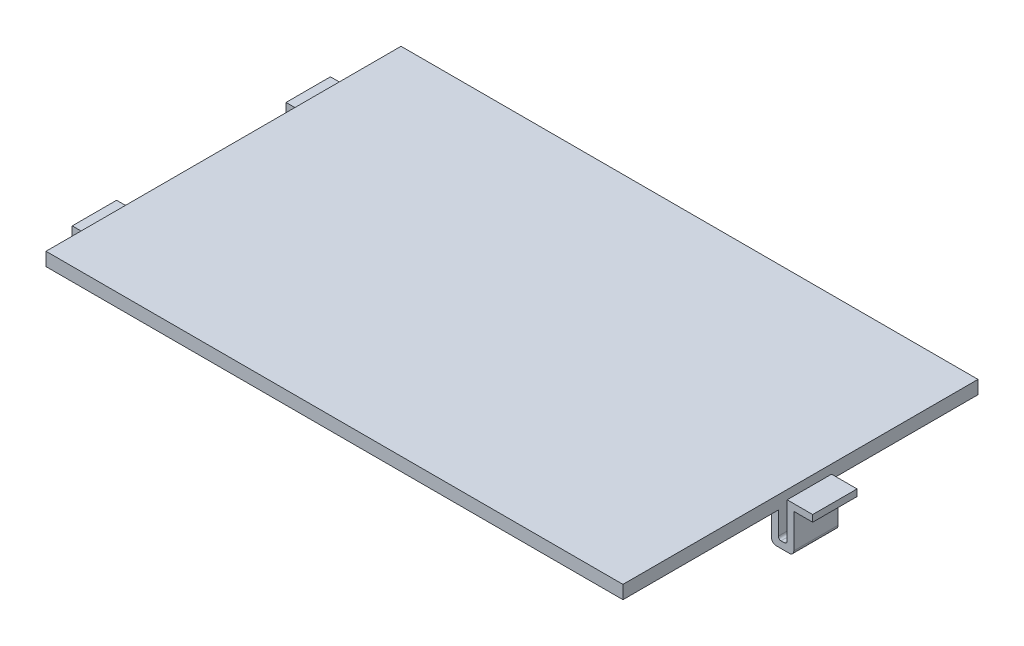
ISO-10303-21;
HEADER;
FILE_DESCRIPTION(('STEP AP214'),'2;1');
FILE_NAME('part.step','',(''),(''),'','','');
FILE_SCHEMA(('AUTOMOTIVE_DESIGN { 1 0 10303 214 1 1 1 1 }'));
ENDSEC;
DATA;
#1=APPLICATION_CONTEXT('core data for automotive mechanical design processes');
#2=APPLICATION_PROTOCOL_DEFINITION('international standard','automotive_design',2000,#1);
#3=PRODUCT_CONTEXT('',#1,'mechanical');
#4=PRODUCT('Part','Part','',(#3));
#5=PRODUCT_RELATED_PRODUCT_CATEGORY('part','',(#4));
#6=PRODUCT_DEFINITION_FORMATION('','',#4);
#7=PRODUCT_DEFINITION_CONTEXT('part definition',#1,'design');
#8=PRODUCT_DEFINITION('design','',#6,#7);
#9=PRODUCT_DEFINITION_SHAPE('','',#8);
#10=(LENGTH_UNIT() NAMED_UNIT(*) SI_UNIT(.MILLI.,.METRE.));
#11=(NAMED_UNIT(*) PLANE_ANGLE_UNIT() SI_UNIT($,.RADIAN.));
#12=(NAMED_UNIT(*) SI_UNIT($,.STERADIAN.) SOLID_ANGLE_UNIT());
#13=UNCERTAINTY_MEASURE_WITH_UNIT(LENGTH_MEASURE(1.E-05),#10,'distance_accuracy_value','');
#14=(GEOMETRIC_REPRESENTATION_CONTEXT(3) GLOBAL_UNCERTAINTY_ASSIGNED_CONTEXT((#13)) GLOBAL_UNIT_ASSIGNED_CONTEXT((#10,
#11,#12)) REPRESENTATION_CONTEXT('',''));
#15=CARTESIAN_POINT('',(0.,0.,0.));
#16=DIRECTION('',(0.,0.,1.));
#17=DIRECTION('',(1.,0.,0.));
#18=AXIS2_PLACEMENT_3D('',#15,#16,#17);
#19=CARTESIAN_POINT('',(-65.,3.,-40.));
#20=DIRECTION('',(1.,0.,0.));
#21=DIRECTION('',(0.,0.,-1.));
#22=AXIS2_PLACEMENT_3D('',#19,#20,#21);
#23=PLANE('',#22);
#24=DIRECTION('',(0.,0.,-1.));
#25=VECTOR('',#24,1.);
#26=CARTESIAN_POINT('',(-65.,0.,19.0899000892805));
#27=LINE('',#26,#25);
#28=CARTESIAN_POINT('',(-65.,0.,29.0899000892805));
#29=VERTEX_POINT('',#28);
#30=CARTESIAN_POINT('',(-65.,0.,19.0899000892805));
#31=VERTEX_POINT('',#30);
#32=EDGE_CURVE('E255',#29,#31,#27,.T.);
#33=ORIENTED_EDGE('',*,*,#32,.F.);
#34=DIRECTION('',(0.,0.,1.));
#35=VECTOR('',#34,1.);
#36=CARTESIAN_POINT('',(-65.,0.,-40.));
#37=LINE('',#36,#35);
#38=CARTESIAN_POINT('',(-65.,0.,40.));
#39=VERTEX_POINT('',#38);
#40=EDGE_CURVE('E498',#29,#39,#37,.T.);
#41=ORIENTED_EDGE('',*,*,#40,.T.);
#42=DIRECTION('',(0.,-1.,0.));
#43=VECTOR('',#42,1.);
#44=CARTESIAN_POINT('',(-65.,3.,40.));
#45=LINE('',#44,#43);
#46=CARTESIAN_POINT('',(-65.,3.,40.));
#47=VERTEX_POINT('',#46);
#48=EDGE_CURVE('E508',#47,#39,#45,.T.);
#49=ORIENTED_EDGE('',*,*,#48,.F.);
#50=DIRECTION('',(0.,0.,1.));
#51=VECTOR('',#50,1.);
#52=CARTESIAN_POINT('',(-65.,3.,-40.));
#53=LINE('',#52,#51);
#54=CARTESIAN_POINT('',(-65.,3.,-40.));
#55=VERTEX_POINT('',#54);
#56=EDGE_CURVE('E484',#55,#47,#53,.T.);
#57=ORIENTED_EDGE('',*,*,#56,.F.);
#58=DIRECTION('',(0.,-1.,0.));
#59=VECTOR('',#58,1.);
#60=CARTESIAN_POINT('',(-65.,3.,-40.));
#61=LINE('',#60,#59);
#62=CARTESIAN_POINT('',(-65.,0.,-40.));
#63=VERTEX_POINT('',#62);
#64=EDGE_CURVE('E512',#55,#63,#61,.T.);
#65=ORIENTED_EDGE('',*,*,#64,.T.);
#66=CARTESIAN_POINT('',(-65.,0.,-29.0899000892805));
#67=VERTEX_POINT('',#66);
#68=EDGE_CURVE('E499',#63,#67,#37,.T.);
#69=ORIENTED_EDGE('',*,*,#68,.T.);
#70=DIRECTION('',(0.,0.,-1.));
#71=VECTOR('',#70,1.);
#72=CARTESIAN_POINT('',(-65.,0.,-29.0899000892805));
#73=LINE('',#72,#71);
#74=CARTESIAN_POINT('',(-65.,0.,-19.0899000892805));
#75=VERTEX_POINT('',#74);
#76=EDGE_CURVE('E55',#75,#67,#73,.T.);
#77=ORIENTED_EDGE('',*,*,#76,.F.);
#78=EDGE_CURVE('E502',#75,#31,#37,.T.);
#79=ORIENTED_EDGE('',*,*,#78,.T.);
#80=EDGE_LOOP('',(#33,#41,#49,#57,#65,#69,#77,#79));
#81=FACE_BOUND('',#80,.T.);
#82=ADVANCED_FACE('F39',(#81),#23,.F.);
#83=CARTESIAN_POINT('',(0.,0.,0.));
#84=DIRECTION('',(0.,1.,0.));
#85=DIRECTION('',(0.,0.,1.));
#86=AXIS2_PLACEMENT_3D('',#83,#84,#85);
#87=PLANE('',#86);
#88=DIRECTION('',(1.,0.,0.));
#89=VECTOR('',#88,1.);
#90=CARTESIAN_POINT('',(-65.,0.,-29.0899000892805));
#91=LINE('',#90,#89);
#92=CARTESIAN_POINT('',(-61.,0.,-29.0899000892805));
#93=VERTEX_POINT('',#92);
#94=EDGE_CURVE('E294',#67,#93,#91,.T.);
#95=ORIENTED_EDGE('',*,*,#94,.F.);
#96=ORIENTED_EDGE('',*,*,#68,.F.);
#97=DIRECTION('',(-1.,0.,0.));
#98=VECTOR('',#97,1.);
#99=CARTESIAN_POINT('',(-65.,0.,-40.));
#100=LINE('',#99,#98);
#101=CARTESIAN_POINT('',(65.,0.,-40.));
#102=VERTEX_POINT('',#101);
#103=EDGE_CURVE('E495',#102,#63,#100,.T.);
#104=ORIENTED_EDGE('',*,*,#103,.F.);
#105=DIRECTION('',(0.,0.,-1.));
#106=VECTOR('',#105,1.);
#107=CARTESIAN_POINT('',(65.,0.,-40.));
#108=LINE('',#107,#106);
#109=CARTESIAN_POINT('',(65.,0.,-5.));
#110=VERTEX_POINT('',#109);
#111=EDGE_CURVE('E442',#110,#102,#108,.T.);
#112=ORIENTED_EDGE('',*,*,#111,.F.);
#113=DIRECTION('',(1.,0.,0.));
#114=VECTOR('',#113,1.);
#115=CARTESIAN_POINT('',(0.,0.,-5.));
#116=LINE('',#115,#114);
#117=CARTESIAN_POINT('',(63.5,0.,-5.));
#118=VERTEX_POINT('',#117);
#119=EDGE_CURVE('E11',#118,#110,#116,.T.);
#120=ORIENTED_EDGE('',*,*,#119,.F.);
#121=DIRECTION('',(0.,0.,1.));
#122=VECTOR('',#121,1.);
#123=CARTESIAN_POINT('',(63.5,0.,0.));
#124=LINE('',#123,#122);
#125=CARTESIAN_POINT('',(63.5,0.,5.));
#126=VERTEX_POINT('',#125);
#127=EDGE_CURVE('E48',#118,#126,#124,.T.);
#128=ORIENTED_EDGE('',*,*,#127,.T.);
#129=DIRECTION('',(1.,0.,0.));
#130=VECTOR('',#129,1.);
#131=CARTESIAN_POINT('',(0.,0.,5.));
#132=LINE('',#131,#130);
#133=CARTESIAN_POINT('',(65.,0.,5.));
#134=VERTEX_POINT('',#133);
#135=EDGE_CURVE('E520',#126,#134,#132,.T.);
#136=ORIENTED_EDGE('',*,*,#135,.T.);
#137=CARTESIAN_POINT('',(65.,0.,40.));
#138=VERTEX_POINT('',#137);
#139=EDGE_CURVE('E491',#138,#134,#108,.T.);
#140=ORIENTED_EDGE('',*,*,#139,.F.);
#141=DIRECTION('',(1.,0.,0.));
#142=VECTOR('',#141,1.);
#143=CARTESIAN_POINT('',(-65.,0.,40.));
#144=LINE('',#143,#142);
#145=EDGE_CURVE('E481',#39,#138,#144,.T.);
#146=ORIENTED_EDGE('',*,*,#145,.F.);
#147=ORIENTED_EDGE('',*,*,#40,.F.);
#148=DIRECTION('',(-1.,0.,0.));
#149=VECTOR('',#148,1.);
#150=CARTESIAN_POINT('',(-65.,0.,29.0899000892805));
#151=LINE('',#150,#149);
#152=CARTESIAN_POINT('',(-61.,0.,29.0899000892805));
#153=VERTEX_POINT('',#152);
#154=EDGE_CURVE('E238',#153,#29,#151,.T.);
#155=ORIENTED_EDGE('',*,*,#154,.F.);
#156=DIRECTION('',(0.,0.,1.));
#157=VECTOR('',#156,1.);
#158=CARTESIAN_POINT('',(-61.,0.,29.0899000892805));
#159=LINE('',#158,#157);
#160=CARTESIAN_POINT('',(-61.,0.,19.0899000892805));
#161=VERTEX_POINT('',#160);
#162=EDGE_CURVE('E328',#161,#153,#159,.T.);
#163=ORIENTED_EDGE('',*,*,#162,.F.);
#164=DIRECTION('',(1.,0.,0.));
#165=VECTOR('',#164,1.);
#166=CARTESIAN_POINT('',(-65.,0.,19.0899000892805));
#167=LINE('',#166,#165);
#168=EDGE_CURVE('E319',#31,#161,#167,.T.);
#169=ORIENTED_EDGE('',*,*,#168,.F.);
#170=ORIENTED_EDGE('',*,*,#78,.F.);
#171=DIRECTION('',(-1.,0.,0.));
#172=VECTOR('',#171,1.);
#173=CARTESIAN_POINT('',(-65.,0.,-19.0899000892805));
#174=LINE('',#173,#172);
#175=CARTESIAN_POINT('',(-61.,0.,-19.0899000892805));
#176=VERTEX_POINT('',#175);
#177=EDGE_CURVE('E299',#176,#75,#174,.T.);
#178=ORIENTED_EDGE('',*,*,#177,.F.);
#179=DIRECTION('',(0.,0.,1.));
#180=VECTOR('',#179,1.);
#181=CARTESIAN_POINT('',(-61.,0.,-29.0899000892805));
#182=LINE('',#181,#180);
#183=EDGE_CURVE('E308',#93,#176,#182,.T.);
#184=ORIENTED_EDGE('',*,*,#183,.F.);
#185=EDGE_LOOP('',(#95,#96,#104,#112,#120,#128,#136,#140,#146,#147,#155,#163,#169,#170,#178,#184));
#186=FACE_BOUND('',#185,.T.);
#187=ADVANCED_FACE('F527',(#186),#87,.F.);
#188=CARTESIAN_POINT('',(65.,3.,-40.));
#189=DIRECTION('',(-1.,0.,0.));
#190=DIRECTION('',(0.,0.,1.));
#191=AXIS2_PLACEMENT_3D('',#188,#189,#190);
#192=PLANE('',#191);
#193=DIRECTION('',(0.,1.,0.));
#194=VECTOR('',#193,1.);
#195=CARTESIAN_POINT('',(65.,-5.10545533298224,-5.));
#196=LINE('',#195,#194);
#197=CARTESIAN_POINT('',(65.,-5.10545533298225,-5.));
#198=VERTEX_POINT('',#197);
#199=EDGE_CURVE('E434',#198,#110,#196,.T.);
#200=ORIENTED_EDGE('',*,*,#199,.T.);
#201=ORIENTED_EDGE('',*,*,#111,.T.);
#202=DIRECTION('',(0.,-1.,0.));
#203=VECTOR('',#202,1.);
#204=CARTESIAN_POINT('',(65.,3.,-40.));
#205=LINE('',#204,#203);
#206=CARTESIAN_POINT('',(65.,3.,-40.));
#207=VERTEX_POINT('',#206);
#208=EDGE_CURVE('E516',#207,#102,#205,.T.);
#209=ORIENTED_EDGE('',*,*,#208,.F.);
#210=DIRECTION('',(0.,0.,-1.));
#211=VECTOR('',#210,1.);
#212=CARTESIAN_POINT('',(65.,3.,-40.));
#213=LINE('',#212,#211);
#214=CARTESIAN_POINT('',(65.,3.,40.));
#215=VERTEX_POINT('',#214);
#216=EDGE_CURVE('E476',#215,#207,#213,.T.);
#217=ORIENTED_EDGE('',*,*,#216,.F.);
#218=DIRECTION('',(0.,-1.,0.));
#219=VECTOR('',#218,1.);
#220=CARTESIAN_POINT('',(65.,3.,40.));
#221=LINE('',#220,#219);
#222=EDGE_CURVE('E490',#215,#138,#221,.T.);
#223=ORIENTED_EDGE('',*,*,#222,.T.);
#224=ORIENTED_EDGE('',*,*,#139,.T.);
#225=DIRECTION('',(0.,1.,0.));
#226=VECTOR('',#225,1.);
#227=CARTESIAN_POINT('',(65.,-5.10545533298224,5.));
#228=LINE('',#227,#226);
#229=CARTESIAN_POINT('',(65.,-5.10545533298225,5.));
#230=VERTEX_POINT('',#229);
#231=EDGE_CURVE('E63',#230,#134,#228,.T.);
#232=ORIENTED_EDGE('',*,*,#231,.F.);
#233=DIRECTION('',(0.,0.,1.));
#234=VECTOR('',#233,1.);
#235=CARTESIAN_POINT('',(65.,-5.10545533298225,-5.));
#236=LINE('',#235,#234);
#237=EDGE_CURVE('E439',#198,#230,#236,.T.);
#238=ORIENTED_EDGE('',*,*,#237,.F.);
#239=EDGE_LOOP('',(#200,#201,#209,#217,#223,#224,#232,#238));
#240=FACE_BOUND('',#239,.T.);
#241=ADVANCED_FACE('F41',(#240),#192,.F.);
#242=CARTESIAN_POINT('',(-65.,3.,-40.));
#243=DIRECTION('',(0.,0.,1.));
#244=DIRECTION('',(1.,0.,0.));
#245=AXIS2_PLACEMENT_3D('',#242,#243,#244);
#246=PLANE('',#245);
#247=ORIENTED_EDGE('',*,*,#103,.T.);
#248=ORIENTED_EDGE('',*,*,#64,.F.);
#249=DIRECTION('',(-1.,0.,0.));
#250=VECTOR('',#249,1.);
#251=CARTESIAN_POINT('',(-65.,3.,-40.));
#252=LINE('',#251,#250);
#253=EDGE_CURVE('E480',#207,#55,#252,.T.);
#254=ORIENTED_EDGE('',*,*,#253,.F.);
#255=ORIENTED_EDGE('',*,*,#208,.T.);
#256=EDGE_LOOP('',(#247,#248,#254,#255));
#257=FACE_BOUND('',#256,.T.);
#258=ADVANCED_FACE('F629',(#257),#246,.F.);
#259=CARTESIAN_POINT('',(-65.,3.,40.));
#260=DIRECTION('',(0.,0.,-1.));
#261=DIRECTION('',(-1.,0.,0.));
#262=AXIS2_PLACEMENT_3D('',#259,#260,#261);
#263=PLANE('',#262);
#264=ORIENTED_EDGE('',*,*,#145,.T.);
#265=ORIENTED_EDGE('',*,*,#222,.F.);
#266=DIRECTION('',(1.,0.,0.));
#267=VECTOR('',#266,1.);
#268=CARTESIAN_POINT('',(-65.,3.,40.));
#269=LINE('',#268,#267);
#270=EDGE_CURVE('E487',#47,#215,#269,.T.);
#271=ORIENTED_EDGE('',*,*,#270,.F.);
#272=ORIENTED_EDGE('',*,*,#48,.T.);
#273=EDGE_LOOP('',(#264,#265,#271,#272));
#274=FACE_BOUND('',#273,.T.);
#275=ADVANCED_FACE('F590',(#274),#263,.F.);
#276=CARTESIAN_POINT('',(0.,3.,0.));
#277=DIRECTION('',(0.,1.,0.));
#278=DIRECTION('',(0.,0.,1.));
#279=AXIS2_PLACEMENT_3D('',#276,#277,#278);
#280=PLANE('',#279);
#281=ORIENTED_EDGE('',*,*,#216,.T.);
#282=ORIENTED_EDGE('',*,*,#253,.T.);
#283=ORIENTED_EDGE('',*,*,#56,.T.);
#284=ORIENTED_EDGE('',*,*,#270,.T.);
#285=EDGE_LOOP('',(#281,#282,#283,#284));
#286=FACE_BOUND('',#285,.T.);
#287=ADVANCED_FACE('F635',(#286),#280,.T.);
#288=CARTESIAN_POINT('',(63.5,1.5,-5.));
#289=DIRECTION('',(-1.,0.,0.));
#290=DIRECTION('',(0.,0.,1.));
#291=AXIS2_PLACEMENT_3D('',#288,#289,#290);
#292=PLANE('',#291);
#293=ORIENTED_EDGE('',*,*,#127,.F.);
#294=DIRECTION('',(0.,-1.,0.));
#295=VECTOR('',#294,1.);
#296=CARTESIAN_POINT('',(63.5,1.5,-5.));
#297=LINE('',#296,#295);
#298=CARTESIAN_POINT('',(63.5,-6.20545533298224,-5.));
#299=VERTEX_POINT('',#298);
#300=EDGE_CURVE('E387',#118,#299,#297,.T.);
#301=ORIENTED_EDGE('',*,*,#300,.T.);
#302=DIRECTION('',(0.,0.,1.));
#303=VECTOR('',#302,1.);
#304=CARTESIAN_POINT('',(63.5,-6.20545533298224,-5.));
#305=LINE('',#304,#303);
#306=CARTESIAN_POINT('',(63.5,-6.20545533298224,5.));
#307=VERTEX_POINT('',#306);
#308=EDGE_CURVE('E438',#299,#307,#305,.T.);
#309=ORIENTED_EDGE('',*,*,#308,.T.);
#310=DIRECTION('',(0.,-1.,0.));
#311=VECTOR('',#310,1.);
#312=CARTESIAN_POINT('',(63.5,1.5,5.));
#313=LINE('',#312,#311);
#314=EDGE_CURVE('E339',#126,#307,#313,.T.);
#315=ORIENTED_EDGE('',*,*,#314,.F.);
#316=EDGE_LOOP('',(#293,#301,#309,#315));
#317=FACE_BOUND('',#316,.T.);
#318=ADVANCED_FACE('F533',(#317),#292,.T.);
#319=CARTESIAN_POINT('',(64.5,-6.20545533298225,-5.));
#320=DIRECTION('',(0.,0.,1.));
#321=DIRECTION('',(1.,0.,0.));
#322=AXIS2_PLACEMENT_3D('',#319,#320,#321);
#323=PLANE('',#322);
#324=ORIENTED_EDGE('',*,*,#300,.F.);
#325=ORIENTED_EDGE('',*,*,#119,.T.);
#326=ORIENTED_EDGE('',*,*,#199,.F.);
#327=CARTESIAN_POINT('',(65.6,-5.10545533298225,-5.));
#328=DIRECTION('',(0.,0.,-1.));
#329=DIRECTION('',(-1.,0.,0.));
#330=AXIS2_PLACEMENT_3D('',#327,#328,#329);
#331=CIRCLE('',#330,0.600000000000002);
#332=CARTESIAN_POINT('',(65.6,-5.70545533298225,-5.));
#333=VERTEX_POINT('',#332);
#334=EDGE_CURVE('E430',#333,#198,#331,.T.);
#335=ORIENTED_EDGE('',*,*,#334,.F.);
#336=DIRECTION('',(-1.,0.,0.));
#337=VECTOR('',#336,1.);
#338=CARTESIAN_POINT('',(66.4,-5.70545533298225,-5.));
#339=LINE('',#338,#337);
#340=CARTESIAN_POINT('',(66.4,-5.70545533298225,-5.));
#341=VERTEX_POINT('',#340);
#342=EDGE_CURVE('E426',#341,#333,#339,.T.);
#343=ORIENTED_EDGE('',*,*,#342,.F.);
#344=CARTESIAN_POINT('',(66.4,-5.10545533298225,-5.));
#345=DIRECTION('',(0.,0.,-1.));
#346=DIRECTION('',(-1.,0.,0.));
#347=AXIS2_PLACEMENT_3D('',#344,#345,#346);
#348=CIRCLE('',#347,0.600000000000002);
#349=CARTESIAN_POINT('',(67.,-5.10545533298224,-5.));
#350=VERTEX_POINT('',#349);
#351=EDGE_CURVE('E422',#350,#341,#348,.T.);
#352=ORIENTED_EDGE('',*,*,#351,.F.);
#353=DIRECTION('',(0.,-1.,0.));
#354=VECTOR('',#353,1.);
#355=CARTESIAN_POINT('',(67.,3.,-5.));
#356=LINE('',#355,#354);
#357=CARTESIAN_POINT('',(67.,3.,-5.));
#358=VERTEX_POINT('',#357);
#359=EDGE_CURVE('E418',#358,#350,#356,.T.);
#360=ORIENTED_EDGE('',*,*,#359,.F.);
#361=DIRECTION('',(-1.,0.,0.));
#362=VECTOR('',#361,1.);
#363=CARTESIAN_POINT('',(67.,3.,-5.));
#364=LINE('',#363,#362);
#365=CARTESIAN_POINT('',(72.7473030796311,3.,-5.));
#366=VERTEX_POINT('',#365);
#367=EDGE_CURVE('E414',#366,#358,#364,.T.);
#368=ORIENTED_EDGE('',*,*,#367,.F.);
#369=DIRECTION('',(0.,1.,0.));
#370=VECTOR('',#369,1.);
#371=CARTESIAN_POINT('',(72.7473030796311,3.,-5.));
#372=LINE('',#371,#370);
#373=CARTESIAN_POINT('',(72.7473030796311,1.5,-5.));
#374=VERTEX_POINT('',#373);
#375=EDGE_CURVE('E410',#374,#366,#372,.T.);
#376=ORIENTED_EDGE('',*,*,#375,.F.);
#377=DIRECTION('',(1.,0.,0.));
#378=VECTOR('',#377,1.);
#379=CARTESIAN_POINT('',(68.5,1.5,-5.));
#380=LINE('',#379,#378);
#381=CARTESIAN_POINT('',(68.5,1.5,-5.));
#382=VERTEX_POINT('',#381);
#383=EDGE_CURVE('E406',#382,#374,#380,.T.);
#384=ORIENTED_EDGE('',*,*,#383,.F.);
#385=DIRECTION('',(0.,1.,0.));
#386=VECTOR('',#385,1.);
#387=CARTESIAN_POINT('',(68.5,-6.20545533298224,-5.));
#388=LINE('',#387,#386);
#389=CARTESIAN_POINT('',(68.5,-6.20545533298225,-5.));
#390=VERTEX_POINT('',#389);
#391=EDGE_CURVE('E402',#390,#382,#388,.T.);
#392=ORIENTED_EDGE('',*,*,#391,.F.);
#393=CARTESIAN_POINT('',(67.5,-6.20545533298225,-5.));
#394=DIRECTION('',(0.,0.,1.));
#395=DIRECTION('',(1.,0.,0.));
#396=AXIS2_PLACEMENT_3D('',#393,#394,#395);
#397=CIRCLE('',#396,1.);
#398=CARTESIAN_POINT('',(67.5,-7.20545533298225,-5.));
#399=VERTEX_POINT('',#398);
#400=EDGE_CURVE('E398',#399,#390,#397,.T.);
#401=ORIENTED_EDGE('',*,*,#400,.F.);
#402=DIRECTION('',(1.,0.,0.));
#403=VECTOR('',#402,1.);
#404=CARTESIAN_POINT('',(64.5,-7.20545533298225,-5.));
#405=LINE('',#404,#403);
#406=CARTESIAN_POINT('',(64.5,-7.20545533298225,-5.));
#407=VERTEX_POINT('',#406);
#408=EDGE_CURVE('E394',#407,#399,#405,.T.);
#409=ORIENTED_EDGE('',*,*,#408,.F.);
#410=CARTESIAN_POINT('',(64.5,-6.20545533298225,-5.));
#411=DIRECTION('',(0.,0.,1.));
#412=DIRECTION('',(1.,0.,0.));
#413=AXIS2_PLACEMENT_3D('',#410,#411,#412);
#414=CIRCLE('',#413,1.);
#415=EDGE_CURVE('E390',#299,#407,#414,.T.);
#416=ORIENTED_EDGE('',*,*,#415,.F.);
#417=EDGE_LOOP('',(#324,#325,#326,#335,#343,#352,#360,#368,#376,#384,#392,#401,#409,#416));
#418=FACE_BOUND('',#417,.T.);
#419=ADVANCED_FACE('F537',(#418),#323,.F.);
#420=CARTESIAN_POINT('',(64.5,-6.20545533298225,5.));
#421=DIRECTION('',(0.,0.,1.));
#422=DIRECTION('',(1.,0.,0.));
#423=AXIS2_PLACEMENT_3D('',#420,#421,#422);
#424=PLANE('',#423);
#425=ORIENTED_EDGE('',*,*,#135,.F.);
#426=ORIENTED_EDGE('',*,*,#314,.T.);
#427=CARTESIAN_POINT('',(64.5,-6.20545533298225,5.));
#428=DIRECTION('',(0.,0.,1.));
#429=DIRECTION('',(1.,0.,0.));
#430=AXIS2_PLACEMENT_3D('',#427,#428,#429);
#431=CIRCLE('',#430,1.);
#432=CARTESIAN_POINT('',(64.5,-7.20545533298225,5.));
#433=VERTEX_POINT('',#432);
#434=EDGE_CURVE('E342',#307,#433,#431,.T.);
#435=ORIENTED_EDGE('',*,*,#434,.T.);
#436=DIRECTION('',(1.,0.,0.));
#437=VECTOR('',#436,1.);
#438=CARTESIAN_POINT('',(64.5,-7.20545533298225,5.));
#439=LINE('',#438,#437);
#440=CARTESIAN_POINT('',(67.5,-7.20545533298225,5.));
#441=VERTEX_POINT('',#440);
#442=EDGE_CURVE('E346',#433,#441,#439,.T.);
#443=ORIENTED_EDGE('',*,*,#442,.T.);
#444=CARTESIAN_POINT('',(67.5,-6.20545533298225,5.));
#445=DIRECTION('',(0.,0.,1.));
#446=DIRECTION('',(1.,0.,0.));
#447=AXIS2_PLACEMENT_3D('',#444,#445,#446);
#448=CIRCLE('',#447,1.);
#449=CARTESIAN_POINT('',(68.5,-6.20545533298225,5.));
#450=VERTEX_POINT('',#449);
#451=EDGE_CURVE('E350',#441,#450,#448,.T.);
#452=ORIENTED_EDGE('',*,*,#451,.T.);
#453=DIRECTION('',(0.,1.,0.));
#454=VECTOR('',#453,1.);
#455=CARTESIAN_POINT('',(68.5,-6.20545533298224,5.));
#456=LINE('',#455,#454);
#457=CARTESIAN_POINT('',(68.5,1.5,5.));
#458=VERTEX_POINT('',#457);
#459=EDGE_CURVE('E354',#450,#458,#456,.T.);
#460=ORIENTED_EDGE('',*,*,#459,.T.);
#461=DIRECTION('',(1.,0.,0.));
#462=VECTOR('',#461,1.);
#463=CARTESIAN_POINT('',(68.5,1.5,5.));
#464=LINE('',#463,#462);
#465=CARTESIAN_POINT('',(72.7473030796311,1.5,5.));
#466=VERTEX_POINT('',#465);
#467=EDGE_CURVE('E358',#458,#466,#464,.T.);
#468=ORIENTED_EDGE('',*,*,#467,.T.);
#469=DIRECTION('',(0.,1.,0.));
#470=VECTOR('',#469,1.);
#471=CARTESIAN_POINT('',(72.7473030796311,3.,5.));
#472=LINE('',#471,#470);
#473=CARTESIAN_POINT('',(72.7473030796311,3.,5.));
#474=VERTEX_POINT('',#473);
#475=EDGE_CURVE('E362',#466,#474,#472,.T.);
#476=ORIENTED_EDGE('',*,*,#475,.T.);
#477=DIRECTION('',(-1.,0.,0.));
#478=VECTOR('',#477,1.);
#479=CARTESIAN_POINT('',(67.,3.,5.));
#480=LINE('',#479,#478);
#481=CARTESIAN_POINT('',(67.,3.,5.));
#482=VERTEX_POINT('',#481);
#483=EDGE_CURVE('E366',#474,#482,#480,.T.);
#484=ORIENTED_EDGE('',*,*,#483,.T.);
#485=DIRECTION('',(0.,-1.,0.));
#486=VECTOR('',#485,1.);
#487=CARTESIAN_POINT('',(67.,3.,5.));
#488=LINE('',#487,#486);
#489=CARTESIAN_POINT('',(67.,-5.10545533298224,5.));
#490=VERTEX_POINT('',#489);
#491=EDGE_CURVE('E370',#482,#490,#488,.T.);
#492=ORIENTED_EDGE('',*,*,#491,.T.);
#493=CARTESIAN_POINT('',(66.4,-5.10545533298225,5.));
#494=DIRECTION('',(0.,0.,-1.));
#495=DIRECTION('',(-1.,0.,0.));
#496=AXIS2_PLACEMENT_3D('',#493,#494,#495);
#497=CIRCLE('',#496,0.600000000000002);
#498=CARTESIAN_POINT('',(66.4,-5.70545533298225,5.));
#499=VERTEX_POINT('',#498);
#500=EDGE_CURVE('E374',#490,#499,#497,.T.);
#501=ORIENTED_EDGE('',*,*,#500,.T.);
#502=DIRECTION('',(-1.,0.,0.));
#503=VECTOR('',#502,1.);
#504=CARTESIAN_POINT('',(66.4,-5.70545533298225,5.));
#505=LINE('',#504,#503);
#506=CARTESIAN_POINT('',(65.6,-5.70545533298225,5.));
#507=VERTEX_POINT('',#506);
#508=EDGE_CURVE('E378',#499,#507,#505,.T.);
#509=ORIENTED_EDGE('',*,*,#508,.T.);
#510=CARTESIAN_POINT('',(65.6,-5.10545533298225,5.));
#511=DIRECTION('',(0.,0.,-1.));
#512=DIRECTION('',(-1.,0.,0.));
#513=AXIS2_PLACEMENT_3D('',#510,#511,#512);
#514=CIRCLE('',#513,0.600000000000002);
#515=EDGE_CURVE('E382',#507,#230,#514,.T.);
#516=ORIENTED_EDGE('',*,*,#515,.T.);
#517=ORIENTED_EDGE('',*,*,#231,.T.);
#518=EDGE_LOOP('',(#425,#426,#435,#443,#452,#460,#468,#476,#484,#492,#501,#509,#516,#517));
#519=FACE_BOUND('',#518,.T.);
#520=ADVANCED_FACE('F545',(#519),#424,.T.);
#521=CARTESIAN_POINT('',(65.6,-5.10545533298225,-5.));
#522=DIRECTION('',(0.,0.,1.));
#523=DIRECTION('',(1.,0.,0.));
#524=AXIS2_PLACEMENT_3D('',#521,#522,#523);
#525=CYLINDRICAL_SURFACE('',#524,0.600000000000002);
#526=ORIENTED_EDGE('',*,*,#237,.T.);
#527=ORIENTED_EDGE('',*,*,#515,.F.);
#528=DIRECTION('',(0.,0.,1.));
#529=VECTOR('',#528,1.);
#530=CARTESIAN_POINT('',(65.6,-5.70545533298225,-5.));
#531=LINE('',#530,#529);
#532=EDGE_CURVE('E443',#333,#507,#531,.T.);
#533=ORIENTED_EDGE('',*,*,#532,.F.);
#534=ORIENTED_EDGE('',*,*,#334,.T.);
#535=EDGE_LOOP('',(#526,#527,#533,#534));
#536=FACE_BOUND('',#535,.T.);
#537=ADVANCED_FACE('F582',(#536),#525,.F.);
#538=CARTESIAN_POINT('',(66.4,-5.70545533298225,-5.));
#539=DIRECTION('',(0.,1.,0.));
#540=DIRECTION('',(-1.,0.,0.));
#541=AXIS2_PLACEMENT_3D('',#538,#539,#540);
#542=PLANE('',#541);
#543=ORIENTED_EDGE('',*,*,#532,.T.);
#544=ORIENTED_EDGE('',*,*,#508,.F.);
#545=DIRECTION('',(0.,0.,1.));
#546=VECTOR('',#545,1.);
#547=CARTESIAN_POINT('',(66.4,-5.70545533298225,-5.));
#548=LINE('',#547,#546);
#549=EDGE_CURVE('E446',#341,#499,#548,.T.);
#550=ORIENTED_EDGE('',*,*,#549,.F.);
#551=ORIENTED_EDGE('',*,*,#342,.T.);
#552=EDGE_LOOP('',(#543,#544,#550,#551));
#553=FACE_BOUND('',#552,.T.);
#554=ADVANCED_FACE('F578',(#553),#542,.T.);
#555=CARTESIAN_POINT('',(66.4,-5.10545533298225,-5.));
#556=DIRECTION('',(0.,0.,1.));
#557=DIRECTION('',(1.,0.,0.));
#558=AXIS2_PLACEMENT_3D('',#555,#556,#557);
#559=CYLINDRICAL_SURFACE('',#558,0.600000000000002);
#560=ORIENTED_EDGE('',*,*,#549,.T.);
#561=ORIENTED_EDGE('',*,*,#500,.F.);
#562=DIRECTION('',(0.,0.,1.));
#563=VECTOR('',#562,1.);
#564=CARTESIAN_POINT('',(67.,-5.10545533298224,-5.));
#565=LINE('',#564,#563);
#566=EDGE_CURVE('E449',#350,#490,#565,.T.);
#567=ORIENTED_EDGE('',*,*,#566,.F.);
#568=ORIENTED_EDGE('',*,*,#351,.T.);
#569=EDGE_LOOP('',(#560,#561,#567,#568));
#570=FACE_BOUND('',#569,.T.);
#571=ADVANCED_FACE('F574',(#570),#559,.F.);
#572=CARTESIAN_POINT('',(67.,3.,-5.));
#573=DIRECTION('',(-1.,0.,0.));
#574=DIRECTION('',(0.,0.,1.));
#575=AXIS2_PLACEMENT_3D('',#572,#573,#574);
#576=PLANE('',#575);
#577=ORIENTED_EDGE('',*,*,#566,.T.);
#578=ORIENTED_EDGE('',*,*,#491,.F.);
#579=DIRECTION('',(0.,0.,1.));
#580=VECTOR('',#579,1.);
#581=CARTESIAN_POINT('',(67.,3.,-5.));
#582=LINE('',#581,#580);
#583=EDGE_CURVE('E452',#358,#482,#582,.T.);
#584=ORIENTED_EDGE('',*,*,#583,.F.);
#585=ORIENTED_EDGE('',*,*,#359,.T.);
#586=EDGE_LOOP('',(#577,#578,#584,#585));
#587=FACE_BOUND('',#586,.T.);
#588=ADVANCED_FACE('F572',(#587),#576,.T.);
#589=CARTESIAN_POINT('',(67.,3.,-5.));
#590=DIRECTION('',(0.,1.,0.));
#591=DIRECTION('',(0.,0.,1.));
#592=AXIS2_PLACEMENT_3D('',#589,#590,#591);
#593=PLANE('',#592);
#594=ORIENTED_EDGE('',*,*,#583,.T.);
#595=ORIENTED_EDGE('',*,*,#483,.F.);
#596=DIRECTION('',(0.,0.,1.));
#597=VECTOR('',#596,1.);
#598=CARTESIAN_POINT('',(72.7473030796311,3.,-5.));
#599=LINE('',#598,#597);
#600=EDGE_CURVE('E455',#366,#474,#599,.T.);
#601=ORIENTED_EDGE('',*,*,#600,.F.);
#602=ORIENTED_EDGE('',*,*,#367,.T.);
#603=EDGE_LOOP('',(#594,#595,#601,#602));
#604=FACE_BOUND('',#603,.T.);
#605=ADVANCED_FACE('F567',(#604),#593,.T.);
#606=CARTESIAN_POINT('',(72.7473030796311,3.,-5.));
#607=DIRECTION('',(1.,0.,0.));
#608=DIRECTION('',(0.,0.,-1.));
#609=AXIS2_PLACEMENT_3D('',#606,#607,#608);
#610=PLANE('',#609);
#611=ORIENTED_EDGE('',*,*,#600,.T.);
#612=ORIENTED_EDGE('',*,*,#475,.F.);
#613=DIRECTION('',(0.,0.,1.));
#614=VECTOR('',#613,1.);
#615=CARTESIAN_POINT('',(72.7473030796311,1.5,-5.));
#616=LINE('',#615,#614);
#617=EDGE_CURVE('E458',#374,#466,#616,.T.);
#618=ORIENTED_EDGE('',*,*,#617,.F.);
#619=ORIENTED_EDGE('',*,*,#375,.T.);
#620=EDGE_LOOP('',(#611,#612,#618,#619));
#621=FACE_BOUND('',#620,.T.);
#622=ADVANCED_FACE('F562',(#621),#610,.T.);
#623=CARTESIAN_POINT('',(68.5,1.5,-5.));
#624=DIRECTION('',(0.,-1.,0.));
#625=DIRECTION('',(0.,0.,-1.));
#626=AXIS2_PLACEMENT_3D('',#623,#624,#625);
#627=PLANE('',#626);
#628=ORIENTED_EDGE('',*,*,#617,.T.);
#629=ORIENTED_EDGE('',*,*,#467,.F.);
#630=DIRECTION('',(0.,0.,1.));
#631=VECTOR('',#630,1.);
#632=CARTESIAN_POINT('',(68.5,1.5,-5.));
#633=LINE('',#632,#631);
#634=EDGE_CURVE('E461',#382,#458,#633,.T.);
#635=ORIENTED_EDGE('',*,*,#634,.F.);
#636=ORIENTED_EDGE('',*,*,#383,.T.);
#637=EDGE_LOOP('',(#628,#629,#635,#636));
#638=FACE_BOUND('',#637,.T.);
#639=ADVANCED_FACE('F560',(#638),#627,.T.);
#640=CARTESIAN_POINT('',(68.5,-6.20545533298224,-5.));
#641=DIRECTION('',(1.,0.,0.));
#642=DIRECTION('',(0.,0.,-1.));
#643=AXIS2_PLACEMENT_3D('',#640,#641,#642);
#644=PLANE('',#643);
#645=ORIENTED_EDGE('',*,*,#634,.T.);
#646=ORIENTED_EDGE('',*,*,#459,.F.);
#647=DIRECTION('',(0.,0.,1.));
#648=VECTOR('',#647,1.);
#649=CARTESIAN_POINT('',(68.5,-6.20545533298225,-5.));
#650=LINE('',#649,#648);
#651=EDGE_CURVE('E464',#390,#450,#650,.T.);
#652=ORIENTED_EDGE('',*,*,#651,.F.);
#653=ORIENTED_EDGE('',*,*,#391,.T.);
#654=EDGE_LOOP('',(#645,#646,#652,#653));
#655=FACE_BOUND('',#654,.T.);
#656=ADVANCED_FACE('F555',(#655),#644,.T.);
#657=CARTESIAN_POINT('',(67.5,-6.20545533298225,-5.));
#658=DIRECTION('',(0.,0.,1.));
#659=DIRECTION('',(1.,0.,0.));
#660=AXIS2_PLACEMENT_3D('',#657,#658,#659);
#661=CYLINDRICAL_SURFACE('',#660,1.);
#662=ORIENTED_EDGE('',*,*,#651,.T.);
#663=ORIENTED_EDGE('',*,*,#451,.F.);
#664=DIRECTION('',(0.,0.,1.));
#665=VECTOR('',#664,1.);
#666=CARTESIAN_POINT('',(67.5,-7.20545533298225,-5.));
#667=LINE('',#666,#665);
#668=EDGE_CURVE('E467',#399,#441,#667,.T.);
#669=ORIENTED_EDGE('',*,*,#668,.F.);
#670=ORIENTED_EDGE('',*,*,#400,.T.);
#671=EDGE_LOOP('',(#662,#663,#669,#670));
#672=FACE_BOUND('',#671,.T.);
#673=ADVANCED_FACE('F550',(#672),#661,.T.);
#674=CARTESIAN_POINT('',(64.5,-7.20545533298225,-5.));
#675=DIRECTION('',(0.,-1.,0.));
#676=DIRECTION('',(1.,0.,0.));
#677=AXIS2_PLACEMENT_3D('',#674,#675,#676);
#678=PLANE('',#677);
#679=ORIENTED_EDGE('',*,*,#668,.T.);
#680=ORIENTED_EDGE('',*,*,#442,.F.);
#681=DIRECTION('',(0.,0.,1.));
#682=VECTOR('',#681,1.);
#683=CARTESIAN_POINT('',(64.5,-7.20545533298225,-5.));
#684=LINE('',#683,#682);
#685=EDGE_CURVE('E470',#407,#433,#684,.T.);
#686=ORIENTED_EDGE('',*,*,#685,.F.);
#687=ORIENTED_EDGE('',*,*,#408,.T.);
#688=EDGE_LOOP('',(#679,#680,#686,#687));
#689=FACE_BOUND('',#688,.T.);
#690=ADVANCED_FACE('F548',(#689),#678,.T.);
#691=CARTESIAN_POINT('',(64.5,-6.20545533298225,-5.));
#692=DIRECTION('',(0.,0.,1.));
#693=DIRECTION('',(1.,0.,0.));
#694=AXIS2_PLACEMENT_3D('',#691,#692,#693);
#695=CYLINDRICAL_SURFACE('',#694,1.);
#696=ORIENTED_EDGE('',*,*,#685,.T.);
#697=ORIENTED_EDGE('',*,*,#434,.F.);
#698=ORIENTED_EDGE('',*,*,#308,.F.);
#699=ORIENTED_EDGE('',*,*,#415,.T.);
#700=EDGE_LOOP('',(#696,#697,#698,#699));
#701=FACE_BOUND('',#700,.T.);
#702=ADVANCED_FACE('F542',(#701),#695,.T.);
#703=CARTESIAN_POINT('',(-65.,-2.,19.0899000892805));
#704=DIRECTION('',(0.,0.,1.));
#705=DIRECTION('',(1.,0.,0.));
#706=AXIS2_PLACEMENT_3D('',#703,#704,#705);
#707=PLANE('',#706);
#708=ORIENTED_EDGE('',*,*,#168,.T.);
#709=DIRECTION('',(0.,1.,0.));
#710=VECTOR('',#709,1.);
#711=CARTESIAN_POINT('',(-61.,-2.,19.0899000892805));
#712=LINE('',#711,#710);
#713=CARTESIAN_POINT('',(-61.,-2.,19.0899000892805));
#714=VERTEX_POINT('',#713);
#715=EDGE_CURVE('E233',#714,#161,#712,.T.);
#716=ORIENTED_EDGE('',*,*,#715,.F.);
#717=DIRECTION('',(1.,0.,0.));
#718=VECTOR('',#717,1.);
#719=CARTESIAN_POINT('',(-65.,-2.,19.0899000892805));
#720=LINE('',#719,#718);
#721=CARTESIAN_POINT('',(-70.,-2.,19.0899000892805));
#722=VERTEX_POINT('',#721);
#723=EDGE_CURVE('E226',#722,#714,#720,.T.);
#724=ORIENTED_EDGE('',*,*,#723,.F.);
#725=DIRECTION('',(0.,-1.,0.));
#726=VECTOR('',#725,1.);
#727=CARTESIAN_POINT('',(-70.,-2.,19.0899000892805));
#728=LINE('',#727,#726);
#729=CARTESIAN_POINT('',(-70.,0.,19.0899000892805));
#730=VERTEX_POINT('',#729);
#731=EDGE_CURVE('E231',#730,#722,#728,.T.);
#732=ORIENTED_EDGE('',*,*,#731,.F.);
#733=DIRECTION('',(1.,0.,0.));
#734=VECTOR('',#733,1.);
#735=CARTESIAN_POINT('',(-70.,0.,19.0899000892805));
#736=LINE('',#735,#734);
#737=EDGE_CURVE('E263',#730,#31,#736,.T.);
#738=ORIENTED_EDGE('',*,*,#737,.T.);
#739=EDGE_LOOP('',(#708,#716,#724,#732,#738));
#740=FACE_BOUND('',#739,.T.);
#741=ADVANCED_FACE('F228',(#740),#707,.F.);
#742=CARTESIAN_POINT('',(-61.,-2.,29.0899000892805));
#743=DIRECTION('',(-1.,0.,0.));
#744=DIRECTION('',(0.,0.,1.));
#745=AXIS2_PLACEMENT_3D('',#742,#743,#744);
#746=PLANE('',#745);
#747=ORIENTED_EDGE('',*,*,#162,.T.);
#748=DIRECTION('',(0.,1.,0.));
#749=VECTOR('',#748,1.);
#750=CARTESIAN_POINT('',(-61.,-2.,29.0899000892805));
#751=LINE('',#750,#749);
#752=CARTESIAN_POINT('',(-61.,-2.,29.0899000892805));
#753=VERTEX_POINT('',#752);
#754=EDGE_CURVE('E325',#753,#153,#751,.T.);
#755=ORIENTED_EDGE('',*,*,#754,.F.);
#756=DIRECTION('',(0.,0.,1.));
#757=VECTOR('',#756,1.);
#758=CARTESIAN_POINT('',(-61.,-2.,29.0899000892805));
#759=LINE('',#758,#757);
#760=EDGE_CURVE('E237',#714,#753,#759,.T.);
#761=ORIENTED_EDGE('',*,*,#760,.F.);
#762=ORIENTED_EDGE('',*,*,#715,.T.);
#763=EDGE_LOOP('',(#747,#755,#761,#762));
#764=FACE_BOUND('',#763,.T.);
#765=ADVANCED_FACE('F602',(#764),#746,.F.);
#766=CARTESIAN_POINT('',(-65.,-2.,29.0899000892805));
#767=DIRECTION('',(0.,0.,-1.));
#768=DIRECTION('',(-1.,0.,0.));
#769=AXIS2_PLACEMENT_3D('',#766,#767,#768);
#770=PLANE('',#769);
#771=ORIENTED_EDGE('',*,*,#154,.T.);
#772=DIRECTION('',(1.,0.,0.));
#773=VECTOR('',#772,1.);
#774=CARTESIAN_POINT('',(-70.,0.,29.0899000892805));
#775=LINE('',#774,#773);
#776=CARTESIAN_POINT('',(-70.,0.,29.0899000892805));
#777=VERTEX_POINT('',#776);
#778=EDGE_CURVE('E267',#777,#29,#775,.T.);
#779=ORIENTED_EDGE('',*,*,#778,.F.);
#780=DIRECTION('',(0.,1.,0.));
#781=VECTOR('',#780,1.);
#782=CARTESIAN_POINT('',(-70.,-2.,29.0899000892805));
#783=LINE('',#782,#781);
#784=CARTESIAN_POINT('',(-70.,-2.,29.0899000892805));
#785=VERTEX_POINT('',#784);
#786=EDGE_CURVE('E248',#785,#777,#783,.T.);
#787=ORIENTED_EDGE('',*,*,#786,.F.);
#788=DIRECTION('',(-1.,0.,0.));
#789=VECTOR('',#788,1.);
#790=CARTESIAN_POINT('',(-65.,-2.,29.0899000892805));
#791=LINE('',#790,#789);
#792=EDGE_CURVE('E244',#753,#785,#791,.T.);
#793=ORIENTED_EDGE('',*,*,#792,.F.);
#794=ORIENTED_EDGE('',*,*,#754,.T.);
#795=EDGE_LOOP('',(#771,#779,#787,#793,#794));
#796=FACE_BOUND('',#795,.T.);
#797=ADVANCED_FACE('F605',(#796),#770,.F.);
#798=CARTESIAN_POINT('',(0.,-2.,0.));
#799=DIRECTION('',(0.,-1.,0.));
#800=DIRECTION('',(0.,0.,-1.));
#801=AXIS2_PLACEMENT_3D('',#798,#799,#800);
#802=PLANE('',#801);
#803=ORIENTED_EDGE('',*,*,#792,.T.);
#804=DIRECTION('',(0.,0.,1.));
#805=VECTOR('',#804,1.);
#806=CARTESIAN_POINT('',(-70.,-2.,19.0899000892805));
#807=LINE('',#806,#805);
#808=EDGE_CURVE('E241',#722,#785,#807,.T.);
#809=ORIENTED_EDGE('',*,*,#808,.F.);
#810=ORIENTED_EDGE('',*,*,#723,.T.);
#811=ORIENTED_EDGE('',*,*,#760,.T.);
#812=EDGE_LOOP('',(#803,#809,#810,#811));
#813=FACE_BOUND('',#812,.T.);
#814=ADVANCED_FACE('F242',(#813),#802,.T.);
#815=CARTESIAN_POINT('',(-65.,-2.,-29.0899000892805));
#816=DIRECTION('',(0.,0.,1.));
#817=DIRECTION('',(1.,0.,0.));
#818=AXIS2_PLACEMENT_3D('',#815,#816,#817);
#819=PLANE('',#818);
#820=ORIENTED_EDGE('',*,*,#94,.T.);
#821=DIRECTION('',(0.,1.,0.));
#822=VECTOR('',#821,1.);
#823=CARTESIAN_POINT('',(-61.,-2.,-29.0899000892805));
#824=LINE('',#823,#822);
#825=CARTESIAN_POINT('',(-61.,-2.,-29.0899000892805));
#826=VERTEX_POINT('',#825);
#827=EDGE_CURVE('E316',#826,#93,#824,.T.);
#828=ORIENTED_EDGE('',*,*,#827,.F.);
#829=DIRECTION('',(1.,0.,0.));
#830=VECTOR('',#829,1.);
#831=CARTESIAN_POINT('',(-65.,-2.,-29.0899000892805));
#832=LINE('',#831,#830);
#833=CARTESIAN_POINT('',(-70.,-2.,-29.0899000892805));
#834=VERTEX_POINT('',#833);
#835=EDGE_CURVE('E295',#834,#826,#832,.T.);
#836=ORIENTED_EDGE('',*,*,#835,.F.);
#837=DIRECTION('',(0.,-1.,0.));
#838=VECTOR('',#837,1.);
#839=CARTESIAN_POINT('',(-70.,-2.,-29.0899000892805));
#840=LINE('',#839,#838);
#841=CARTESIAN_POINT('',(-70.,0.,-29.0899000892805));
#842=VERTEX_POINT('',#841);
#843=EDGE_CURVE('E270',#842,#834,#840,.T.);
#844=ORIENTED_EDGE('',*,*,#843,.F.);
#845=DIRECTION('',(1.,0.,0.));
#846=VECTOR('',#845,1.);
#847=CARTESIAN_POINT('',(-70.,0.,-29.0899000892805));
#848=LINE('',#847,#846);
#849=EDGE_CURVE('E284',#842,#67,#848,.T.);
#850=ORIENTED_EDGE('',*,*,#849,.T.);
#851=EDGE_LOOP('',(#820,#828,#836,#844,#850));
#852=FACE_BOUND('',#851,.T.);
#853=ADVANCED_FACE('F648',(#852),#819,.F.);
#854=CARTESIAN_POINT('',(-61.,-2.,-29.0899000892805));
#855=DIRECTION('',(-1.,0.,0.));
#856=DIRECTION('',(0.,0.,1.));
#857=AXIS2_PLACEMENT_3D('',#854,#855,#856);
#858=PLANE('',#857);
#859=ORIENTED_EDGE('',*,*,#183,.T.);
#860=DIRECTION('',(0.,1.,0.));
#861=VECTOR('',#860,1.);
#862=CARTESIAN_POINT('',(-61.,-2.,-19.0899000892805));
#863=LINE('',#862,#861);
#864=CARTESIAN_POINT('',(-61.,-2.,-19.0899000892805));
#865=VERTEX_POINT('',#864);
#866=EDGE_CURVE('E305',#865,#176,#863,.T.);
#867=ORIENTED_EDGE('',*,*,#866,.F.);
#868=DIRECTION('',(0.,0.,1.));
#869=VECTOR('',#868,1.);
#870=CARTESIAN_POINT('',(-61.,-2.,-29.0899000892805));
#871=LINE('',#870,#869);
#872=EDGE_CURVE('E298',#826,#865,#871,.T.);
#873=ORIENTED_EDGE('',*,*,#872,.F.);
#874=ORIENTED_EDGE('',*,*,#827,.T.);
#875=EDGE_LOOP('',(#859,#867,#873,#874));
#876=FACE_BOUND('',#875,.T.);
#877=ADVANCED_FACE('F657',(#876),#858,.F.);
#878=CARTESIAN_POINT('',(-65.,-2.,-19.0899000892805));
#879=DIRECTION('',(0.,0.,-1.));
#880=DIRECTION('',(-1.,0.,0.));
#881=AXIS2_PLACEMENT_3D('',#878,#879,#880);
#882=PLANE('',#881);
#883=ORIENTED_EDGE('',*,*,#177,.T.);
#884=DIRECTION('',(1.,0.,0.));
#885=VECTOR('',#884,1.);
#886=CARTESIAN_POINT('',(-70.,0.,-19.0899000892805));
#887=LINE('',#886,#885);
#888=CARTESIAN_POINT('',(-70.,0.,-19.0899000892805));
#889=VERTEX_POINT('',#888);
#890=EDGE_CURVE('E290',#889,#75,#887,.T.);
#891=ORIENTED_EDGE('',*,*,#890,.F.);
#892=DIRECTION('',(0.,1.,0.));
#893=VECTOR('',#892,1.);
#894=CARTESIAN_POINT('',(-70.,-2.,-19.0899000892805));
#895=LINE('',#894,#893);
#896=CARTESIAN_POINT('',(-70.,-2.,-19.0899000892805));
#897=VERTEX_POINT('',#896);
#898=EDGE_CURVE('E278',#897,#889,#895,.T.);
#899=ORIENTED_EDGE('',*,*,#898,.F.);
#900=DIRECTION('',(-1.,0.,0.));
#901=VECTOR('',#900,1.);
#902=CARTESIAN_POINT('',(-65.,-2.,-19.0899000892805));
#903=LINE('',#902,#901);
#904=EDGE_CURVE('E302',#865,#897,#903,.T.);
#905=ORIENTED_EDGE('',*,*,#904,.F.);
#906=ORIENTED_EDGE('',*,*,#866,.T.);
#907=EDGE_LOOP('',(#883,#891,#899,#905,#906));
#908=FACE_BOUND('',#907,.T.);
#909=ADVANCED_FACE('F653',(#908),#882,.F.);
#910=CARTESIAN_POINT('',(0.,-2.,0.));
#911=DIRECTION('',(0.,1.,0.));
#912=DIRECTION('',(0.,0.,1.));
#913=AXIS2_PLACEMENT_3D('',#910,#911,#912);
#914=PLANE('',#913);
#915=ORIENTED_EDGE('',*,*,#904,.T.);
#916=DIRECTION('',(0.,0.,1.));
#917=VECTOR('',#916,1.);
#918=CARTESIAN_POINT('',(-70.,-2.,-29.0899000892805));
#919=LINE('',#918,#917);
#920=EDGE_CURVE('E274',#834,#897,#919,.T.);
#921=ORIENTED_EDGE('',*,*,#920,.F.);
#922=ORIENTED_EDGE('',*,*,#835,.T.);
#923=ORIENTED_EDGE('',*,*,#872,.T.);
#924=EDGE_LOOP('',(#915,#921,#922,#923));
#925=FACE_BOUND('',#924,.T.);
#926=ADVANCED_FACE('F659',(#925),#914,.F.);
#927=CARTESIAN_POINT('',(-70.,0.,-29.0899000892805));
#928=DIRECTION('',(0.,-1.,0.));
#929=DIRECTION('',(0.,0.,-1.));
#930=AXIS2_PLACEMENT_3D('',#927,#928,#929);
#931=PLANE('',#930);
#932=ORIENTED_EDGE('',*,*,#76,.T.);
#933=ORIENTED_EDGE('',*,*,#849,.F.);
#934=DIRECTION('',(0.,0.,-1.));
#935=VECTOR('',#934,1.);
#936=CARTESIAN_POINT('',(-70.,0.,-29.0899000892805));
#937=LINE('',#936,#935);
#938=EDGE_CURVE('E281',#889,#842,#937,.T.);
#939=ORIENTED_EDGE('',*,*,#938,.F.);
#940=ORIENTED_EDGE('',*,*,#890,.T.);
#941=EDGE_LOOP('',(#932,#933,#939,#940));
#942=FACE_BOUND('',#941,.T.);
#943=ADVANCED_FACE('F617',(#942),#931,.F.);
#944=CARTESIAN_POINT('',(-70.,0.,0.));
#945=DIRECTION('',(1.,0.,0.));
#946=DIRECTION('',(0.,0.,-1.));
#947=AXIS2_PLACEMENT_3D('',#944,#945,#946);
#948=PLANE('',#947);
#949=ORIENTED_EDGE('',*,*,#843,.T.);
#950=ORIENTED_EDGE('',*,*,#920,.T.);
#951=ORIENTED_EDGE('',*,*,#898,.T.);
#952=ORIENTED_EDGE('',*,*,#938,.T.);
#953=EDGE_LOOP('',(#949,#950,#951,#952));
#954=FACE_BOUND('',#953,.T.);
#955=ADVANCED_FACE('F610',(#954),#948,.F.);
#956=CARTESIAN_POINT('',(-70.,0.,19.0899000892805));
#957=DIRECTION('',(0.,-1.,0.));
#958=DIRECTION('',(0.,0.,-1.));
#959=AXIS2_PLACEMENT_3D('',#956,#957,#958);
#960=PLANE('',#959);
#961=ORIENTED_EDGE('',*,*,#32,.T.);
#962=ORIENTED_EDGE('',*,*,#737,.F.);
#963=DIRECTION('',(0.,0.,-1.));
#964=VECTOR('',#963,1.);
#965=CARTESIAN_POINT('',(-70.,0.,19.0899000892805));
#966=LINE('',#965,#964);
#967=EDGE_CURVE('E252',#777,#730,#966,.T.);
#968=ORIENTED_EDGE('',*,*,#967,.F.);
#969=ORIENTED_EDGE('',*,*,#778,.T.);
#970=EDGE_LOOP('',(#961,#962,#968,#969));
#971=FACE_BOUND('',#970,.T.);
#972=ADVANCED_FACE('F608',(#971),#960,.F.);
#973=CARTESIAN_POINT('',(-70.,0.,0.));
#974=DIRECTION('',(1.,0.,0.));
#975=DIRECTION('',(0.,0.,-1.));
#976=AXIS2_PLACEMENT_3D('',#973,#974,#975);
#977=PLANE('',#976);
#978=ORIENTED_EDGE('',*,*,#731,.T.);
#979=ORIENTED_EDGE('',*,*,#808,.T.);
#980=ORIENTED_EDGE('',*,*,#786,.T.);
#981=ORIENTED_EDGE('',*,*,#967,.T.);
#982=EDGE_LOOP('',(#978,#979,#980,#981));
#983=FACE_BOUND('',#982,.T.);
#984=ADVANCED_FACE('F250',(#983),#977,.F.);
#985=CLOSED_SHELL('',(#82,#187,#241,#258,#275,#287,#318,#419,#520,#537,#554,#571,#588,#605,#622,
#639,#656,#673,#690,#702,#741,#765,#797,#814,#853,#877,#909,#926,#943,#955,#972,#984));
#986=MANIFOLD_SOLID_BREP('B2',#985);
#987=ADVANCED_BREP_SHAPE_REPRESENTATION('',(#18,#986),#14);
#988=SHAPE_DEFINITION_REPRESENTATION(#9,#987);
ENDSEC;
END-ISO-10303-21;
